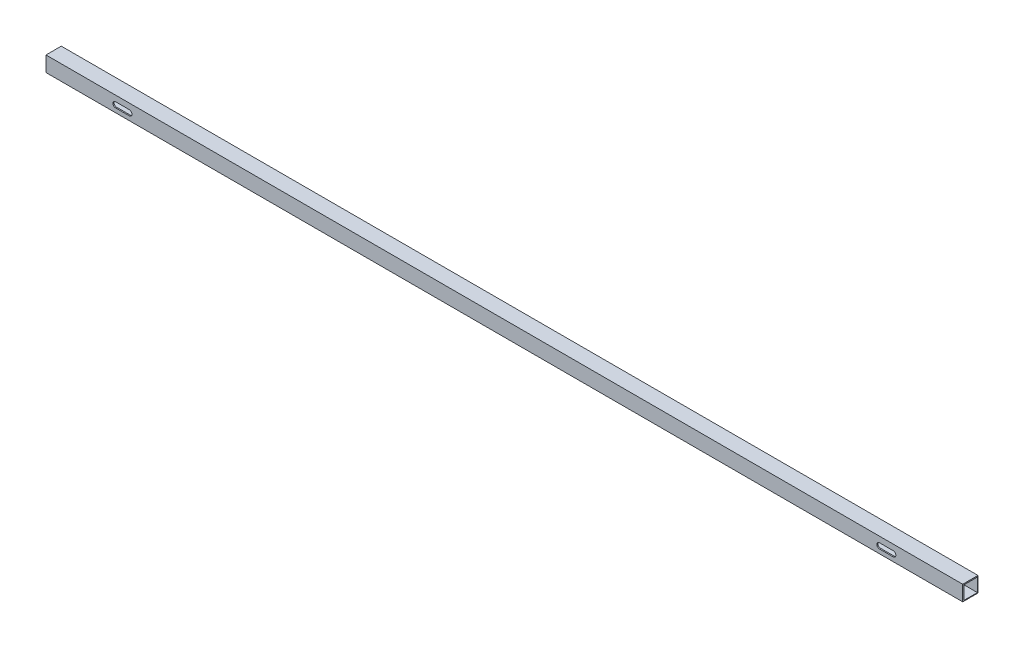
ISO-10303-21;
HEADER;
FILE_DESCRIPTION(('STEP AP214'),'2;1');
FILE_NAME('part.step','',(''),(''),'','','');
FILE_SCHEMA(('AUTOMOTIVE_DESIGN { 1 0 10303 214 1 1 1 1 }'));
ENDSEC;
DATA;
#1=APPLICATION_CONTEXT('core data for automotive mechanical design processes');
#2=APPLICATION_PROTOCOL_DEFINITION('international standard','automotive_design',2000,#1);
#3=PRODUCT_CONTEXT('',#1,'mechanical');
#4=PRODUCT('Part','Part','',(#3));
#5=PRODUCT_RELATED_PRODUCT_CATEGORY('part','',(#4));
#6=PRODUCT_DEFINITION_FORMATION('','',#4);
#7=PRODUCT_DEFINITION_CONTEXT('part definition',#1,'design');
#8=PRODUCT_DEFINITION('design','',#6,#7);
#9=PRODUCT_DEFINITION_SHAPE('','',#8);
#10=(LENGTH_UNIT() NAMED_UNIT(*) SI_UNIT(.MILLI.,.METRE.));
#11=(NAMED_UNIT(*) PLANE_ANGLE_UNIT() SI_UNIT($,.RADIAN.));
#12=(NAMED_UNIT(*) SI_UNIT($,.STERADIAN.) SOLID_ANGLE_UNIT());
#13=UNCERTAINTY_MEASURE_WITH_UNIT(LENGTH_MEASURE(1.E-05),#10,'distance_accuracy_value','');
#14=(GEOMETRIC_REPRESENTATION_CONTEXT(3) GLOBAL_UNCERTAINTY_ASSIGNED_CONTEXT((#13)) GLOBAL_UNIT_ASSIGNED_CONTEXT((#10,
#11,#12)) REPRESENTATION_CONTEXT('',''));
#15=CARTESIAN_POINT('',(0.,0.,0.));
#16=DIRECTION('',(0.,0.,1.));
#17=DIRECTION('',(1.,0.,0.));
#18=AXIS2_PLACEMENT_3D('',#15,#16,#17);
#19=CARTESIAN_POINT('',(0.,0.,-10.));
#20=DIRECTION('',(-1.,0.,0.));
#21=DIRECTION('',(0.,0.,1.));
#22=AXIS2_PLACEMENT_3D('',#19,#20,#21);
#23=PLANE('',#22);
#24=DIRECTION('',(0.,-1.,0.));
#25=VECTOR('',#24,1.);
#26=CARTESIAN_POINT('',(0.,18.5,8.5));
#27=LINE('',#26,#25);
#28=CARTESIAN_POINT('',(0.,18.5,8.5));
#29=VERTEX_POINT('',#28);
#30=CARTESIAN_POINT('',(0.,0.913143235451412,8.5));
#31=VERTEX_POINT('',#30);
#32=EDGE_CURVE('E215',#29,#31,#27,.T.);
#33=ORIENTED_EDGE('',*,*,#32,.T.);
#34=DIRECTION('',(0.,0.,-1.));
#35=VECTOR('',#34,1.);
#36=CARTESIAN_POINT('',(0.,0.913143235451412,8.5));
#37=LINE('',#36,#35);
#38=CARTESIAN_POINT('',(0.,0.913143235451412,-9.22699108139761));
#39=VERTEX_POINT('',#38);
#40=EDGE_CURVE('E218',#31,#39,#37,.T.);
#41=ORIENTED_EDGE('',*,*,#40,.T.);
#42=DIRECTION('',(0.,1.,0.));
#43=VECTOR('',#42,1.);
#44=CARTESIAN_POINT('',(0.,18.5,-9.22699108139761));
#45=LINE('',#44,#43);
#46=CARTESIAN_POINT('',(0.,18.5,-9.22699108139761));
#47=VERTEX_POINT('',#46);
#48=EDGE_CURVE('E222',#39,#47,#45,.T.);
#49=ORIENTED_EDGE('',*,*,#48,.T.);
#50=DIRECTION('',(0.,0.,1.));
#51=VECTOR('',#50,1.);
#52=CARTESIAN_POINT('',(0.,18.5,8.5));
#53=LINE('',#52,#51);
#54=EDGE_CURVE('E225',#47,#29,#53,.T.);
#55=ORIENTED_EDGE('',*,*,#54,.T.);
#56=EDGE_LOOP('',(#33,#41,#49,#55));
#57=FACE_BOUND('',#56,.T.);
#58=DIRECTION('',(0.,0.,1.));
#59=VECTOR('',#58,1.);
#60=CARTESIAN_POINT('',(0.,0.,-10.));
#61=LINE('',#60,#59);
#62=CARTESIAN_POINT('',(0.,0.,-10.));
#63=VERTEX_POINT('',#62);
#64=CARTESIAN_POINT('',(0.,0.,10.));
#65=VERTEX_POINT('',#64);
#66=EDGE_CURVE('E37',#63,#65,#61,.T.);
#67=ORIENTED_EDGE('',*,*,#66,.T.);
#68=DIRECTION('',(0.,-1.,0.));
#69=VECTOR('',#68,1.);
#70=CARTESIAN_POINT('',(0.,0.,10.));
#71=LINE('',#70,#69);
#72=CARTESIAN_POINT('',(0.,20.,10.));
#73=VERTEX_POINT('',#72);
#74=EDGE_CURVE('E240',#73,#65,#71,.T.);
#75=ORIENTED_EDGE('',*,*,#74,.F.);
#76=DIRECTION('',(0.,0.,1.));
#77=VECTOR('',#76,1.);
#78=CARTESIAN_POINT('',(0.,20.,-10.));
#79=LINE('',#78,#77);
#80=CARTESIAN_POINT('',(0.,20.,-10.));
#81=VERTEX_POINT('',#80);
#82=EDGE_CURVE('E11',#81,#73,#79,.T.);
#83=ORIENTED_EDGE('',*,*,#82,.F.);
#84=DIRECTION('',(0.,-1.,0.));
#85=VECTOR('',#84,1.);
#86=CARTESIAN_POINT('',(0.,0.,-10.));
#87=LINE('',#86,#85);
#88=EDGE_CURVE('E258',#81,#63,#87,.T.);
#89=ORIENTED_EDGE('',*,*,#88,.T.);
#90=EDGE_LOOP('',(#67,#75,#83,#89));
#91=FACE_BOUND('',#90,.T.);
#92=ADVANCED_FACE('F34',(#57,#91),#23,.T.);
#93=CARTESIAN_POINT('',(0.,20.,-10.));
#94=DIRECTION('',(0.,1.,0.));
#95=DIRECTION('',(0.,0.,1.));
#96=AXIS2_PLACEMENT_3D('',#93,#94,#95);
#97=PLANE('',#96);
#98=ORIENTED_EDGE('',*,*,#82,.T.);
#99=DIRECTION('',(-1.,0.,0.));
#100=VECTOR('',#99,1.);
#101=CARTESIAN_POINT('',(0.,20.,10.));
#102=LINE('',#101,#100);
#103=CARTESIAN_POINT('',(1200.,20.,10.));
#104=VERTEX_POINT('',#103);
#105=EDGE_CURVE('E255',#104,#73,#102,.T.);
#106=ORIENTED_EDGE('',*,*,#105,.F.);
#107=DIRECTION('',(0.,0.,1.));
#108=VECTOR('',#107,1.);
#109=CARTESIAN_POINT('',(1200.,20.,-10.));
#110=LINE('',#109,#108);
#111=CARTESIAN_POINT('',(1200.,20.,-10.));
#112=VERTEX_POINT('',#111);
#113=EDGE_CURVE('E42',#112,#104,#110,.T.);
#114=ORIENTED_EDGE('',*,*,#113,.F.);
#115=DIRECTION('',(-1.,0.,0.));
#116=VECTOR('',#115,1.);
#117=CARTESIAN_POINT('',(0.,20.,-10.));
#118=LINE('',#117,#116);
#119=EDGE_CURVE('E267',#112,#81,#118,.T.);
#120=ORIENTED_EDGE('',*,*,#119,.T.);
#121=EDGE_LOOP('',(#98,#106,#114,#120));
#122=FACE_BOUND('',#121,.T.);
#123=ADVANCED_FACE('F283',(#122),#97,.T.);
#124=CARTESIAN_POINT('',(1200.,0.,-10.));
#125=DIRECTION('',(1.,0.,0.));
#126=DIRECTION('',(0.,0.,-1.));
#127=AXIS2_PLACEMENT_3D('',#124,#125,#126);
#128=PLANE('',#127);
#129=DIRECTION('',(0.,-1.,0.));
#130=VECTOR('',#129,1.);
#131=CARTESIAN_POINT('',(1200.,18.5,8.5));
#132=LINE('',#131,#130);
#133=CARTESIAN_POINT('',(1200.,18.5,8.5));
#134=VERTEX_POINT('',#133);
#135=CARTESIAN_POINT('',(1200.,0.913143235451412,8.49999999999999));
#136=VERTEX_POINT('',#135);
#137=EDGE_CURVE('E214',#134,#136,#132,.T.);
#138=ORIENTED_EDGE('',*,*,#137,.F.);
#139=DIRECTION('',(0.,0.,1.));
#140=VECTOR('',#139,1.);
#141=CARTESIAN_POINT('',(1200.,18.5,8.5));
#142=LINE('',#141,#140);
#143=CARTESIAN_POINT('',(1200.,18.5,-9.22699108139761));
#144=VERTEX_POINT('',#143);
#145=EDGE_CURVE('E219',#144,#134,#142,.T.);
#146=ORIENTED_EDGE('',*,*,#145,.F.);
#147=DIRECTION('',(0.,1.,0.));
#148=VECTOR('',#147,1.);
#149=CARTESIAN_POINT('',(1200.,18.5,-9.22699108139761));
#150=LINE('',#149,#148);
#151=CARTESIAN_POINT('',(1200.,0.913143235451412,-9.22699108139761));
#152=VERTEX_POINT('',#151);
#153=EDGE_CURVE('E233',#152,#144,#150,.T.);
#154=ORIENTED_EDGE('',*,*,#153,.F.);
#155=DIRECTION('',(0.,0.,-1.));
#156=VECTOR('',#155,1.);
#157=CARTESIAN_POINT('',(1200.,0.913143235451412,8.5));
#158=LINE('',#157,#156);
#159=EDGE_CURVE('E230',#136,#152,#158,.T.);
#160=ORIENTED_EDGE('',*,*,#159,.F.);
#161=EDGE_LOOP('',(#138,#146,#154,#160));
#162=FACE_BOUND('',#161,.T.);
#163=ORIENTED_EDGE('',*,*,#113,.T.);
#164=DIRECTION('',(0.,1.,0.));
#165=VECTOR('',#164,1.);
#166=CARTESIAN_POINT('',(1200.,0.,10.));
#167=LINE('',#166,#165);
#168=CARTESIAN_POINT('',(1200.,0.,10.));
#169=VERTEX_POINT('',#168);
#170=EDGE_CURVE('E252',#169,#104,#167,.T.);
#171=ORIENTED_EDGE('',*,*,#170,.F.);
#172=DIRECTION('',(0.,0.,1.));
#173=VECTOR('',#172,1.);
#174=CARTESIAN_POINT('',(1200.,0.,-10.));
#175=LINE('',#174,#173);
#176=CARTESIAN_POINT('',(1200.,0.,-10.));
#177=VERTEX_POINT('',#176);
#178=EDGE_CURVE('E270',#177,#169,#175,.T.);
#179=ORIENTED_EDGE('',*,*,#178,.F.);
#180=DIRECTION('',(0.,1.,0.));
#181=VECTOR('',#180,1.);
#182=CARTESIAN_POINT('',(1200.,0.,-10.));
#183=LINE('',#182,#181);
#184=EDGE_CURVE('E264',#177,#112,#183,.T.);
#185=ORIENTED_EDGE('',*,*,#184,.T.);
#186=EDGE_LOOP('',(#163,#171,#179,#185));
#187=FACE_BOUND('',#186,.T.);
#188=ADVANCED_FACE('F289',(#162,#187),#128,.T.);
#189=CARTESIAN_POINT('',(0.,0.,-10.));
#190=DIRECTION('',(0.,-1.,0.));
#191=DIRECTION('',(0.,0.,-1.));
#192=AXIS2_PLACEMENT_3D('',#189,#190,#191);
#193=PLANE('',#192);
#194=CARTESIAN_POINT('',(600.,0.,0.));
#195=DIRECTION('',(0.,-1.,0.));
#196=DIRECTION('',(0.,0.,-1.));
#197=AXIS2_PLACEMENT_3D('',#194,#195,#196);
#198=CIRCLE('',#197,5.99999999999999);
#199=CARTESIAN_POINT('',(600.,0.,-5.99999999999999));
#200=VERTEX_POINT('',#199);
#201=EDGE_CURVE('E482',#200,#200,#198,.T.);
#202=ORIENTED_EDGE('',*,*,#201,.F.);
#203=EDGE_LOOP('',(#202));
#204=FACE_BOUND('',#203,.T.);
#205=ORIENTED_EDGE('',*,*,#178,.T.);
#206=DIRECTION('',(1.,0.,0.));
#207=VECTOR('',#206,1.);
#208=CARTESIAN_POINT('',(0.,0.,10.));
#209=LINE('',#208,#207);
#210=EDGE_CURVE('E249',#65,#169,#209,.T.);
#211=ORIENTED_EDGE('',*,*,#210,.F.);
#212=ORIENTED_EDGE('',*,*,#66,.F.);
#213=DIRECTION('',(1.,0.,0.));
#214=VECTOR('',#213,1.);
#215=CARTESIAN_POINT('',(0.,0.,-10.));
#216=LINE('',#215,#214);
#217=EDGE_CURVE('E261',#63,#177,#216,.T.);
#218=ORIENTED_EDGE('',*,*,#217,.T.);
#219=EDGE_LOOP('',(#205,#211,#212,#218));
#220=FACE_BOUND('',#219,.T.);
#221=ADVANCED_FACE('F277',(#204,#220),#193,.T.);
#222=CARTESIAN_POINT('',(0.,0.,-10.));
#223=DIRECTION('',(0.,0.,-1.));
#224=DIRECTION('',(-1.,0.,0.));
#225=AXIS2_PLACEMENT_3D('',#222,#223,#224);
#226=PLANE('',#225);
#227=ORIENTED_EDGE('',*,*,#88,.F.);
#228=ORIENTED_EDGE('',*,*,#119,.F.);
#229=ORIENTED_EDGE('',*,*,#184,.F.);
#230=ORIENTED_EDGE('',*,*,#217,.F.);
#231=EDGE_LOOP('',(#227,#228,#229,#230));
#232=FACE_BOUND('',#231,.T.);
#233=ADVANCED_FACE('F286',(#232),#226,.T.);
#234=CARTESIAN_POINT('',(0.,0.,10.));
#235=DIRECTION('',(0.,0.,-1.));
#236=DIRECTION('',(-1.,0.,0.));
#237=AXIS2_PLACEMENT_3D('',#234,#235,#236);
#238=PLANE('',#237);
#239=DIRECTION('',(1.,0.,0.));
#240=VECTOR('',#239,1.);
#241=CARTESIAN_POINT('',(1091.,5.5,10.));
#242=LINE('',#241,#240);
#243=CARTESIAN_POINT('',(1091.,5.5,10.));
#244=VERTEX_POINT('',#243);
#245=CARTESIAN_POINT('',(1109.,5.50000000000001,10.));
#246=VERTEX_POINT('',#245);
#247=EDGE_CURVE('E169',#244,#246,#242,.T.);
#248=ORIENTED_EDGE('',*,*,#247,.F.);
#249=CARTESIAN_POINT('',(1091.,9.,10.));
#250=DIRECTION('',(0.,0.,1.));
#251=DIRECTION('',(1.,0.,0.));
#252=AXIS2_PLACEMENT_3D('',#249,#250,#251);
#253=CIRCLE('',#252,3.5);
#254=CARTESIAN_POINT('',(1091.,12.5,10.));
#255=VERTEX_POINT('',#254);
#256=EDGE_CURVE('E50',#255,#244,#253,.T.);
#257=ORIENTED_EDGE('',*,*,#256,.F.);
#258=DIRECTION('',(-1.,0.,0.));
#259=VECTOR('',#258,1.);
#260=CARTESIAN_POINT('',(1091.,12.5,10.));
#261=LINE('',#260,#259);
#262=CARTESIAN_POINT('',(1109.,12.5,10.));
#263=VERTEX_POINT('',#262);
#264=EDGE_CURVE('E155',#263,#255,#261,.T.);
#265=ORIENTED_EDGE('',*,*,#264,.F.);
#266=CARTESIAN_POINT('',(1109.,9.,10.));
#267=DIRECTION('',(0.,0.,1.));
#268=DIRECTION('',(1.,0.,0.));
#269=AXIS2_PLACEMENT_3D('',#266,#267,#268);
#270=CIRCLE('',#269,3.5);
#271=EDGE_CURVE('E175',#246,#263,#270,.T.);
#272=ORIENTED_EDGE('',*,*,#271,.F.);
#273=EDGE_LOOP('',(#248,#257,#265,#272));
#274=FACE_BOUND('',#273,.T.);
#275=DIRECTION('',(1.,0.,0.));
#276=VECTOR('',#275,1.);
#277=CARTESIAN_POINT('',(91.,5.5,10.));
#278=LINE('',#277,#276);
#279=CARTESIAN_POINT('',(91.,5.5,10.));
#280=VERTEX_POINT('',#279);
#281=CARTESIAN_POINT('',(109.,5.5,10.));
#282=VERTEX_POINT('',#281);
#283=EDGE_CURVE('E193',#280,#282,#278,.T.);
#284=ORIENTED_EDGE('',*,*,#283,.F.);
#285=CARTESIAN_POINT('',(91.,9.,10.));
#286=DIRECTION('',(0.,0.,1.));
#287=DIRECTION('',(1.,0.,0.));
#288=AXIS2_PLACEMENT_3D('',#285,#286,#287);
#289=CIRCLE('',#288,3.5);
#290=CARTESIAN_POINT('',(91.,12.5,10.));
#291=VERTEX_POINT('',#290);
#292=EDGE_CURVE('E191',#291,#280,#289,.T.);
#293=ORIENTED_EDGE('',*,*,#292,.F.);
#294=DIRECTION('',(-1.,0.,0.));
#295=VECTOR('',#294,1.);
#296=CARTESIAN_POINT('',(91.,12.5,10.));
#297=LINE('',#296,#295);
#298=CARTESIAN_POINT('',(109.,12.5,10.));
#299=VERTEX_POINT('',#298);
#300=EDGE_CURVE('E199',#299,#291,#297,.T.);
#301=ORIENTED_EDGE('',*,*,#300,.F.);
#302=CARTESIAN_POINT('',(109.,9.,10.));
#303=DIRECTION('',(0.,0.,1.));
#304=DIRECTION('',(1.,0.,0.));
#305=AXIS2_PLACEMENT_3D('',#302,#303,#304);
#306=CIRCLE('',#305,3.5);
#307=EDGE_CURVE('E196',#282,#299,#306,.T.);
#308=ORIENTED_EDGE('',*,*,#307,.F.);
#309=EDGE_LOOP('',(#284,#293,#301,#308));
#310=FACE_BOUND('',#309,.T.);
#311=ORIENTED_EDGE('',*,*,#74,.T.);
#312=ORIENTED_EDGE('',*,*,#210,.T.);
#313=ORIENTED_EDGE('',*,*,#170,.T.);
#314=ORIENTED_EDGE('',*,*,#105,.T.);
#315=EDGE_LOOP('',(#311,#312,#313,#314));
#316=FACE_BOUND('',#315,.T.);
#317=ADVANCED_FACE('F280',(#274,#310,#316),#238,.F.);
#318=CARTESIAN_POINT('',(0.,18.5,8.5));
#319=DIRECTION('',(0.,0.,1.));
#320=DIRECTION('',(0.,-1.,0.));
#321=AXIS2_PLACEMENT_3D('',#318,#319,#320);
#322=PLANE('',#321);
#323=DIRECTION('',(1.,0.,0.));
#324=VECTOR('',#323,1.);
#325=CARTESIAN_POINT('',(1091.,12.5,8.5));
#326=LINE('',#325,#324);
#327=CARTESIAN_POINT('',(1091.,12.5,8.5));
#328=VERTEX_POINT('',#327);
#329=CARTESIAN_POINT('',(1109.,12.5,8.49999999999999));
#330=VERTEX_POINT('',#329);
#331=EDGE_CURVE('E167',#328,#330,#326,.T.);
#332=ORIENTED_EDGE('',*,*,#331,.F.);
#333=CARTESIAN_POINT('',(1091.,9.,8.49999999999999));
#334=DIRECTION('',(0.,0.,1.));
#335=DIRECTION('',(0.,-1.,0.));
#336=AXIS2_PLACEMENT_3D('',#333,#334,#335);
#337=CIRCLE('',#336,3.5);
#338=CARTESIAN_POINT('',(1091.,5.5,8.49999999999999));
#339=VERTEX_POINT('',#338);
#340=EDGE_CURVE('E149',#339,#328,#337,.F.);
#341=ORIENTED_EDGE('',*,*,#340,.F.);
#342=DIRECTION('',(-1.,0.,0.));
#343=VECTOR('',#342,1.);
#344=CARTESIAN_POINT('',(1091.,5.5,8.49999999999999));
#345=LINE('',#344,#343);
#346=CARTESIAN_POINT('',(1109.,5.50000000000001,8.5));
#347=VERTEX_POINT('',#346);
#348=EDGE_CURVE('E158',#347,#339,#345,.T.);
#349=ORIENTED_EDGE('',*,*,#348,.F.);
#350=CARTESIAN_POINT('',(1109.,9.,8.49999999999999));
#351=DIRECTION('',(0.,0.,1.));
#352=DIRECTION('',(0.,-1.,0.));
#353=AXIS2_PLACEMENT_3D('',#350,#351,#352);
#354=CIRCLE('',#353,3.5);
#355=EDGE_CURVE('E58',#330,#347,#354,.F.);
#356=ORIENTED_EDGE('',*,*,#355,.F.);
#357=EDGE_LOOP('',(#332,#341,#349,#356));
#358=FACE_BOUND('',#357,.T.);
#359=DIRECTION('',(1.,0.,0.));
#360=VECTOR('',#359,1.);
#361=CARTESIAN_POINT('',(91.,12.5,8.5));
#362=LINE('',#361,#360);
#363=CARTESIAN_POINT('',(91.,12.5,8.5));
#364=VERTEX_POINT('',#363);
#365=CARTESIAN_POINT('',(109.,12.5,8.49999999999999));
#366=VERTEX_POINT('',#365);
#367=EDGE_CURVE('E185',#364,#366,#362,.T.);
#368=ORIENTED_EDGE('',*,*,#367,.F.);
#369=CARTESIAN_POINT('',(91.,9.,8.49999999999999));
#370=DIRECTION('',(0.,0.,1.));
#371=DIRECTION('',(0.,-1.,0.));
#372=AXIS2_PLACEMENT_3D('',#369,#370,#371);
#373=CIRCLE('',#372,3.5);
#374=CARTESIAN_POINT('',(91.,5.5,8.49999999999999));
#375=VERTEX_POINT('',#374);
#376=EDGE_CURVE('E188',#375,#364,#373,.F.);
#377=ORIENTED_EDGE('',*,*,#376,.F.);
#378=DIRECTION('',(-1.,0.,0.));
#379=VECTOR('',#378,1.);
#380=CARTESIAN_POINT('',(91.,5.5,8.49999999999999));
#381=LINE('',#380,#379);
#382=CARTESIAN_POINT('',(109.,5.5,8.5));
#383=VERTEX_POINT('',#382);
#384=EDGE_CURVE('E205',#383,#375,#381,.T.);
#385=ORIENTED_EDGE('',*,*,#384,.F.);
#386=CARTESIAN_POINT('',(109.,9.,8.49999999999999));
#387=DIRECTION('',(0.,0.,1.));
#388=DIRECTION('',(0.,-1.,0.));
#389=AXIS2_PLACEMENT_3D('',#386,#387,#388);
#390=CIRCLE('',#389,3.5);
#391=EDGE_CURVE('E161',#366,#383,#390,.F.);
#392=ORIENTED_EDGE('',*,*,#391,.F.);
#393=EDGE_LOOP('',(#368,#377,#385,#392));
#394=FACE_BOUND('',#393,.T.);
#395=ORIENTED_EDGE('',*,*,#137,.T.);
#396=DIRECTION('',(1.,0.,0.));
#397=VECTOR('',#396,1.);
#398=CARTESIAN_POINT('',(0.,0.913143235451412,8.5));
#399=LINE('',#398,#397);
#400=EDGE_CURVE('E228',#31,#136,#399,.T.);
#401=ORIENTED_EDGE('',*,*,#400,.F.);
#402=ORIENTED_EDGE('',*,*,#32,.F.);
#403=DIRECTION('',(1.,0.,0.));
#404=VECTOR('',#403,1.);
#405=CARTESIAN_POINT('',(0.,18.5,8.5));
#406=LINE('',#405,#404);
#407=EDGE_CURVE('E238',#29,#134,#406,.T.);
#408=ORIENTED_EDGE('',*,*,#407,.T.);
#409=EDGE_LOOP('',(#395,#401,#402,#408));
#410=FACE_BOUND('',#409,.T.);
#411=ADVANCED_FACE('F164',(#358,#394,#410),#322,.F.);
#412=CARTESIAN_POINT('',(0.,18.5,8.5));
#413=DIRECTION('',(0.,1.,0.));
#414=DIRECTION('',(0.,0.,1.));
#415=AXIS2_PLACEMENT_3D('',#412,#413,#414);
#416=PLANE('',#415);
#417=ORIENTED_EDGE('',*,*,#145,.T.);
#418=ORIENTED_EDGE('',*,*,#407,.F.);
#419=ORIENTED_EDGE('',*,*,#54,.F.);
#420=DIRECTION('',(1.,0.,0.));
#421=VECTOR('',#420,1.);
#422=CARTESIAN_POINT('',(0.,18.5,-9.22699108139761));
#423=LINE('',#422,#421);
#424=EDGE_CURVE('E241',#47,#144,#423,.T.);
#425=ORIENTED_EDGE('',*,*,#424,.T.);
#426=EDGE_LOOP('',(#417,#418,#419,#425));
#427=FACE_BOUND('',#426,.T.);
#428=ADVANCED_FACE('F317',(#427),#416,.F.);
#429=CARTESIAN_POINT('',(0.,18.5,-9.22699108139761));
#430=DIRECTION('',(0.,0.,-1.));
#431=DIRECTION('',(0.,1.,0.));
#432=AXIS2_PLACEMENT_3D('',#429,#430,#431);
#433=PLANE('',#432);
#434=ORIENTED_EDGE('',*,*,#153,.T.);
#435=ORIENTED_EDGE('',*,*,#424,.F.);
#436=ORIENTED_EDGE('',*,*,#48,.F.);
#437=DIRECTION('',(1.,0.,0.));
#438=VECTOR('',#437,1.);
#439=CARTESIAN_POINT('',(0.,0.913143235451412,-9.22699108139761));
#440=LINE('',#439,#438);
#441=EDGE_CURVE('E243',#39,#152,#440,.T.);
#442=ORIENTED_EDGE('',*,*,#441,.T.);
#443=EDGE_LOOP('',(#434,#435,#436,#442));
#444=FACE_BOUND('',#443,.T.);
#445=ADVANCED_FACE('F314',(#444),#433,.F.);
#446=CARTESIAN_POINT('',(0.,0.913143235451412,8.5));
#447=DIRECTION('',(0.,-1.,0.));
#448=DIRECTION('',(0.,0.,-1.));
#449=AXIS2_PLACEMENT_3D('',#446,#447,#448);
#450=PLANE('',#449);
#451=CARTESIAN_POINT('',(600.,0.913143235451414,0.));
#452=DIRECTION('',(0.,-1.,0.));
#453=DIRECTION('',(0.,0.,-1.));
#454=AXIS2_PLACEMENT_3D('',#451,#452,#453);
#455=CIRCLE('',#454,5.99999999999999);
#456=CARTESIAN_POINT('',(600.,0.913143235451414,-5.99999999999999));
#457=VERTEX_POINT('',#456);
#458=EDGE_CURVE('E485',#457,#457,#455,.F.);
#459=ORIENTED_EDGE('',*,*,#458,.F.);
#460=EDGE_LOOP('',(#459));
#461=FACE_BOUND('',#460,.T.);
#462=ORIENTED_EDGE('',*,*,#159,.T.);
#463=ORIENTED_EDGE('',*,*,#441,.F.);
#464=ORIENTED_EDGE('',*,*,#40,.F.);
#465=ORIENTED_EDGE('',*,*,#400,.T.);
#466=EDGE_LOOP('',(#462,#463,#464,#465));
#467=FACE_BOUND('',#466,.T.);
#468=ADVANCED_FACE('F311',(#461,#467),#450,.F.);
#469=CARTESIAN_POINT('',(91.,9.,-10.001));
#470=DIRECTION('',(0.,0.,1.));
#471=DIRECTION('',(1.,0.,0.));
#472=AXIS2_PLACEMENT_3D('',#469,#470,#471);
#473=CYLINDRICAL_SURFACE('',#472,3.5);
#474=ORIENTED_EDGE('',*,*,#376,.T.);
#475=DIRECTION('',(0.,0.,1.));
#476=VECTOR('',#475,1.);
#477=CARTESIAN_POINT('',(91.,12.5,-10.001));
#478=LINE('',#477,#476);
#479=EDGE_CURVE('E203',#364,#291,#478,.T.);
#480=ORIENTED_EDGE('',*,*,#479,.T.);
#481=ORIENTED_EDGE('',*,*,#292,.T.);
#482=DIRECTION('',(0.,0.,1.));
#483=VECTOR('',#482,1.);
#484=CARTESIAN_POINT('',(91.,5.5,-10.001));
#485=LINE('',#484,#483);
#486=EDGE_CURVE('E202',#375,#280,#485,.T.);
#487=ORIENTED_EDGE('',*,*,#486,.F.);
#488=EDGE_LOOP('',(#474,#480,#481,#487));
#489=FACE_BOUND('',#488,.T.);
#490=ADVANCED_FACE('F327',(#489),#473,.F.);
#491=CARTESIAN_POINT('',(91.,12.5,-10.001));
#492=DIRECTION('',(0.,1.,0.));
#493=DIRECTION('',(-1.,0.,0.));
#494=AXIS2_PLACEMENT_3D('',#491,#492,#493);
#495=PLANE('',#494);
#496=ORIENTED_EDGE('',*,*,#367,.T.);
#497=DIRECTION('',(0.,0.,1.));
#498=VECTOR('',#497,1.);
#499=CARTESIAN_POINT('',(109.,12.5,-10.001));
#500=LINE('',#499,#498);
#501=EDGE_CURVE('E206',#366,#299,#500,.T.);
#502=ORIENTED_EDGE('',*,*,#501,.T.);
#503=ORIENTED_EDGE('',*,*,#300,.T.);
#504=ORIENTED_EDGE('',*,*,#479,.F.);
#505=EDGE_LOOP('',(#496,#502,#503,#504));
#506=FACE_BOUND('',#505,.T.);
#507=ADVANCED_FACE('F421',(#506),#495,.F.);
#508=CARTESIAN_POINT('',(109.,9.,-10.001));
#509=DIRECTION('',(0.,0.,1.));
#510=DIRECTION('',(1.,0.,0.));
#511=AXIS2_PLACEMENT_3D('',#508,#509,#510);
#512=CYLINDRICAL_SURFACE('',#511,3.5);
#513=ORIENTED_EDGE('',*,*,#391,.T.);
#514=DIRECTION('',(0.,0.,1.));
#515=VECTOR('',#514,1.);
#516=CARTESIAN_POINT('',(109.,5.5,-10.001));
#517=LINE('',#516,#515);
#518=EDGE_CURVE('E208',#383,#282,#517,.T.);
#519=ORIENTED_EDGE('',*,*,#518,.T.);
#520=ORIENTED_EDGE('',*,*,#307,.T.);
#521=ORIENTED_EDGE('',*,*,#501,.F.);
#522=EDGE_LOOP('',(#513,#519,#520,#521));
#523=FACE_BOUND('',#522,.T.);
#524=ADVANCED_FACE('F424',(#523),#512,.F.);
#525=CARTESIAN_POINT('',(91.,5.5,-10.001));
#526=DIRECTION('',(0.,-1.,0.));
#527=DIRECTION('',(1.,0.,0.));
#528=AXIS2_PLACEMENT_3D('',#525,#526,#527);
#529=PLANE('',#528);
#530=ORIENTED_EDGE('',*,*,#384,.T.);
#531=ORIENTED_EDGE('',*,*,#486,.T.);
#532=ORIENTED_EDGE('',*,*,#283,.T.);
#533=ORIENTED_EDGE('',*,*,#518,.F.);
#534=EDGE_LOOP('',(#530,#531,#532,#533));
#535=FACE_BOUND('',#534,.T.);
#536=ADVANCED_FACE('F362',(#535),#529,.F.);
#537=CARTESIAN_POINT('',(1091.,9.,-10.001));
#538=DIRECTION('',(0.,0.,1.));
#539=DIRECTION('',(1.,0.,0.));
#540=AXIS2_PLACEMENT_3D('',#537,#538,#539);
#541=CYLINDRICAL_SURFACE('',#540,3.5);
#542=ORIENTED_EDGE('',*,*,#340,.T.);
#543=DIRECTION('',(0.,0.,1.));
#544=VECTOR('',#543,1.);
#545=CARTESIAN_POINT('',(1091.,12.5,-10.001));
#546=LINE('',#545,#544);
#547=EDGE_CURVE('E162',#328,#255,#546,.T.);
#548=ORIENTED_EDGE('',*,*,#547,.T.);
#549=ORIENTED_EDGE('',*,*,#256,.T.);
#550=DIRECTION('',(0.,0.,1.));
#551=VECTOR('',#550,1.);
#552=CARTESIAN_POINT('',(1091.,5.5,-10.001));
#553=LINE('',#552,#551);
#554=EDGE_CURVE('E145',#339,#244,#553,.T.);
#555=ORIENTED_EDGE('',*,*,#554,.F.);
#556=EDGE_LOOP('',(#542,#548,#549,#555));
#557=FACE_BOUND('',#556,.T.);
#558=ADVANCED_FACE('F147',(#557),#541,.F.);
#559=CARTESIAN_POINT('',(1091.,12.5,-10.001));
#560=DIRECTION('',(0.,1.,0.));
#561=DIRECTION('',(-1.,0.,0.));
#562=AXIS2_PLACEMENT_3D('',#559,#560,#561);
#563=PLANE('',#562);
#564=ORIENTED_EDGE('',*,*,#331,.T.);
#565=DIRECTION('',(0.,0.,1.));
#566=VECTOR('',#565,1.);
#567=CARTESIAN_POINT('',(1109.,12.5,-10.001));
#568=LINE('',#567,#566);
#569=EDGE_CURVE('E181',#330,#263,#568,.T.);
#570=ORIENTED_EDGE('',*,*,#569,.T.);
#571=ORIENTED_EDGE('',*,*,#264,.T.);
#572=ORIENTED_EDGE('',*,*,#547,.F.);
#573=EDGE_LOOP('',(#564,#570,#571,#572));
#574=FACE_BOUND('',#573,.T.);
#575=ADVANCED_FACE('F361',(#574),#563,.F.);
#576=CARTESIAN_POINT('',(1109.,9.,-10.001));
#577=DIRECTION('',(0.,0.,1.));
#578=DIRECTION('',(1.,0.,0.));
#579=AXIS2_PLACEMENT_3D('',#576,#577,#578);
#580=CYLINDRICAL_SURFACE('',#579,3.5);
#581=ORIENTED_EDGE('',*,*,#355,.T.);
#582=DIRECTION('',(0.,0.,1.));
#583=VECTOR('',#582,1.);
#584=CARTESIAN_POINT('',(1109.,5.50000000000001,-10.001));
#585=LINE('',#584,#583);
#586=EDGE_CURVE('E154',#347,#246,#585,.T.);
#587=ORIENTED_EDGE('',*,*,#586,.T.);
#588=ORIENTED_EDGE('',*,*,#271,.T.);
#589=ORIENTED_EDGE('',*,*,#569,.F.);
#590=EDGE_LOOP('',(#581,#587,#588,#589));
#591=FACE_BOUND('',#590,.T.);
#592=ADVANCED_FACE('F373',(#591),#580,.F.);
#593=CARTESIAN_POINT('',(1091.,5.5,-10.001));
#594=DIRECTION('',(0.,-1.,0.));
#595=DIRECTION('',(1.,0.,0.));
#596=AXIS2_PLACEMENT_3D('',#593,#594,#595);
#597=PLANE('',#596);
#598=ORIENTED_EDGE('',*,*,#348,.T.);
#599=ORIENTED_EDGE('',*,*,#554,.T.);
#600=ORIENTED_EDGE('',*,*,#247,.T.);
#601=ORIENTED_EDGE('',*,*,#586,.F.);
#602=EDGE_LOOP('',(#598,#599,#600,#601));
#603=FACE_BOUND('',#602,.T.);
#604=ADVANCED_FACE('F159',(#603),#597,.F.);
#605=CARTESIAN_POINT('',(600.,20.001,0.));
#606=DIRECTION('',(0.,-1.,0.));
#607=DIRECTION('',(0.,0.,-1.));
#608=AXIS2_PLACEMENT_3D('',#605,#606,#607);
#609=CYLINDRICAL_SURFACE('',#608,5.99999999999999);
#610=ORIENTED_EDGE('',*,*,#201,.T.);
#611=EDGE_LOOP('',(#610));
#612=FACE_BOUND('',#611,.T.);
#613=ORIENTED_EDGE('',*,*,#458,.T.);
#614=EDGE_LOOP('',(#613));
#615=FACE_BOUND('',#614,.T.);
#616=ADVANCED_FACE('F390',(#612,#615),#609,.F.);
#617=CLOSED_SHELL('',(#92,#123,#188,#221,#233,#317,#411,#428,#445,#468,#490,#507,#524,#536,#558,
#575,#592,#604,#616));
#618=MANIFOLD_SOLID_BREP('B2',#617);
#619=ADVANCED_BREP_SHAPE_REPRESENTATION('',(#18,#618),#14);
#620=SHAPE_DEFINITION_REPRESENTATION(#9,#619);
ENDSEC;
END-ISO-10303-21;
